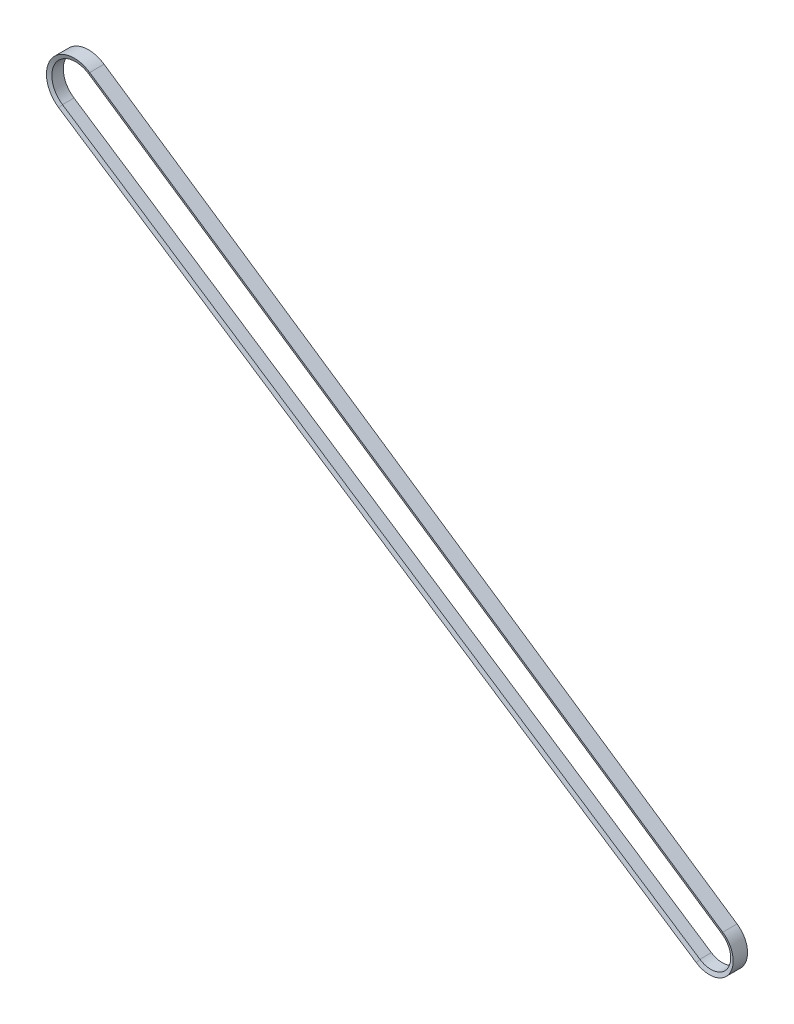
ISO-10303-21;
HEADER;
FILE_DESCRIPTION(('STEP AP214'),'2;1');
FILE_NAME('part.step','',(''),(''),'','','');
FILE_SCHEMA(('AUTOMOTIVE_DESIGN { 1 0 10303 214 1 1 1 1 }'));
ENDSEC;
DATA;
#1=APPLICATION_CONTEXT('core data for automotive mechanical design processes');
#2=APPLICATION_PROTOCOL_DEFINITION('international standard','automotive_design',2000,#1);
#3=PRODUCT_CONTEXT('',#1,'mechanical');
#4=PRODUCT('Part','Part','',(#3));
#5=PRODUCT_RELATED_PRODUCT_CATEGORY('part','',(#4));
#6=PRODUCT_DEFINITION_FORMATION('','',#4);
#7=PRODUCT_DEFINITION_CONTEXT('part definition',#1,'design');
#8=PRODUCT_DEFINITION('design','',#6,#7);
#9=PRODUCT_DEFINITION_SHAPE('','',#8);
#10=(LENGTH_UNIT() NAMED_UNIT(*) SI_UNIT(.MILLI.,.METRE.));
#11=(NAMED_UNIT(*) PLANE_ANGLE_UNIT() SI_UNIT($,.RADIAN.));
#12=(NAMED_UNIT(*) SI_UNIT($,.STERADIAN.) SOLID_ANGLE_UNIT());
#13=UNCERTAINTY_MEASURE_WITH_UNIT(LENGTH_MEASURE(1.E-05),#10,'distance_accuracy_value','');
#14=(GEOMETRIC_REPRESENTATION_CONTEXT(3) GLOBAL_UNCERTAINTY_ASSIGNED_CONTEXT((#13)) GLOBAL_UNIT_ASSIGNED_CONTEXT((#10,
#11,#12)) REPRESENTATION_CONTEXT('',''));
#15=CARTESIAN_POINT('',(0.,0.,0.));
#16=DIRECTION('',(0.,0.,1.));
#17=DIRECTION('',(1.,0.,0.));
#18=AXIS2_PLACEMENT_3D('',#15,#16,#17);
#19=CARTESIAN_POINT('',(169.595632407652,-113.406898021926,-1.535));
#20=DIRECTION('',(0.,0.,-1.));
#21=DIRECTION('',(-1.,0.,0.));
#22=AXIS2_PLACEMENT_3D('',#19,#20,#21);
#23=CONICAL_SURFACE('',#22,5.29999999999987,1.22173047639603);
#24=DIRECTION('',(-0.518306560970144,-0.783824298178355,-0.34202014332567));
#25=VECTOR('',#24,1.);
#26=CARTESIAN_POINT('',(166.672309703638,-117.827778518862,-1.535));
#27=LINE('',#26,#25);
#28=CARTESIAN_POINT('',(166.672309703638,-117.827778518862,-1.535));
#29=VERTEX_POINT('',#28);
#30=CARTESIAN_POINT('',(166.09205970658,-118.705278594996,-1.91789537911135));
#31=VERTEX_POINT('',#30);
#32=EDGE_CURVE('E155',#29,#31,#27,.T.);
#33=ORIENTED_EDGE('',*,*,#32,.F.);
#34=CARTESIAN_POINT('',(169.595632407652,-113.406898021926,-1.535));
#35=DIRECTION('',(0.,0.,1.));
#36=DIRECTION('',(-0.551570321512103,-0.834128395648437,0.));
#37=AXIS2_PLACEMENT_3D('',#34,#35,#36);
#38=CIRCLE('',#37,5.29999999999987);
#39=CARTESIAN_POINT('',(172.564390372754,-109.016399628276,-1.535));
#40=VERTEX_POINT('',#39);
#41=EDGE_CURVE('E154',#29,#40,#38,.T.);
#42=ORIENTED_EDGE('',*,*,#41,.T.);
#43=DIRECTION('',(0.526362255227613,0.778437536242433,-0.34202014332567));
#44=VECTOR('',#43,1.);
#45=CARTESIAN_POINT('',(172.564390372754,-109.016399628276,-1.535));
#46=LINE('',#45,#44);
#47=CARTESIAN_POINT('',(173.153658809711,-108.14493009243,-1.91789537911135));
#48=VERTEX_POINT('',#47);
#49=EDGE_CURVE('E133',#40,#48,#46,.T.);
#50=ORIENTED_EDGE('',*,*,#49,.T.);
#51=CARTESIAN_POINT('',(169.595632407652,-113.406898021926,-1.91789537911135));
#52=DIRECTION('',(0.,0.,1.));
#53=DIRECTION('',(-0.551570321512162,-0.834128395648398,0.));
#54=AXIS2_PLACEMENT_3D('',#51,#52,#53);
#55=CIRCLE('',#54,6.35199640812177);
#56=EDGE_CURVE('E159',#31,#48,#55,.T.);
#57=ORIENTED_EDGE('',*,*,#56,.F.);
#58=EDGE_LOOP('',(#33,#42,#50,#57));
#59=FACE_BOUND('',#58,.T.);
#60=ADVANCED_FACE('F39',(#59),#23,.F.);
#61=CARTESIAN_POINT('',(172.564390372754,-109.016399628276,-1.535));
#62=DIRECTION('',(0.191580193343956,0.28332809242785,0.939692620785908));
#63=DIRECTION('',(0.,-0.957427077668651,0.288675234384364));
#64=AXIS2_PLACEMENT_3D('',#61,#62,#63);
#65=PLANE('',#64);
#66=DIRECTION('',(-0.828395923330359,0.560143012283151,0.));
#67=VECTOR('',#66,1.);
#68=CARTESIAN_POINT('',(173.153658809711,-108.14493009243,-1.91789537911135));
#69=LINE('',#68,#67);
#70=CARTESIAN_POINT('',(4.14729483919354,6.13343746505411,-1.91789537911135));
#71=VERTEX_POINT('',#70);
#72=EDGE_CURVE('E123',#48,#71,#69,.T.);
#73=ORIENTED_EDGE('',*,*,#72,.F.);
#74=ORIENTED_EDGE('',*,*,#49,.F.);
#75=DIRECTION('',(-0.828395923330359,0.560143012283151,0.));
#76=VECTOR('',#75,1.);
#77=CARTESIAN_POINT('',(172.564390372754,-109.016399628276,-1.535));
#78=LINE('',#77,#76);
#79=CARTESIAN_POINT('',(3.55802640223668,5.26196792920798,-1.535));
#80=VERTEX_POINT('',#79);
#81=EDGE_CURVE('E136',#40,#80,#78,.T.);
#82=ORIENTED_EDGE('',*,*,#81,.T.);
#83=DIRECTION('',(0.526362255227613,0.778437536242433,-0.34202014332567));
#84=VECTOR('',#83,1.);
#85=CARTESIAN_POINT('',(3.55802640223674,5.26196792920795,-1.535));
#86=LINE('',#85,#84);
#87=EDGE_CURVE('E151',#80,#71,#86,.T.);
#88=ORIENTED_EDGE('',*,*,#87,.T.);
#89=EDGE_LOOP('',(#73,#74,#82,#88));
#90=FACE_BOUND('',#89,.T.);
#91=ADVANCED_FACE('F135',(#90),#65,.F.);
#92=CARTESIAN_POINT('',(173.153658809711,-108.14493009243,-1.91789537911135));
#93=DIRECTION('',(-0.560143012283151,-0.828395923330359,0.));
#94=DIRECTION('',(0.828395923330359,-0.560143012283151,0.));
#95=AXIS2_PLACEMENT_3D('',#92,#93,#94);
#96=PLANE('',#95);
#97=DIRECTION('',(-0.828395923330359,0.560143012283151,0.));
#98=VECTOR('',#97,1.);
#99=CARTESIAN_POINT('',(173.153658809711,-108.14493009243,1.91789537911135));
#100=LINE('',#99,#98);
#101=CARTESIAN_POINT('',(173.153658809711,-108.14493009243,1.91789537911135));
#102=VERTEX_POINT('',#101);
#103=CARTESIAN_POINT('',(4.14729483919354,6.13343746505411,1.91789537911135));
#104=VERTEX_POINT('',#103);
#105=EDGE_CURVE('E117',#102,#104,#100,.T.);
#106=ORIENTED_EDGE('',*,*,#105,.F.);
#107=DIRECTION('',(0.,0.,1.));
#108=VECTOR('',#107,1.);
#109=CARTESIAN_POINT('',(173.153658809711,-108.14493009243,-1.91789537911135));
#110=LINE('',#109,#108);
#111=EDGE_CURVE('E141',#48,#102,#110,.T.);
#112=ORIENTED_EDGE('',*,*,#111,.F.);
#113=ORIENTED_EDGE('',*,*,#72,.T.);
#114=DIRECTION('',(0.,0.,1.));
#115=VECTOR('',#114,1.);
#116=CARTESIAN_POINT('',(4.1472948391936,6.13343746505408,-1.91789537911135));
#117=LINE('',#116,#115);
#118=EDGE_CURVE('E192',#71,#104,#117,.T.);
#119=ORIENTED_EDGE('',*,*,#118,.T.);
#120=EDGE_LOOP('',(#106,#112,#113,#119));
#121=FACE_BOUND('',#120,.T.);
#122=ADVANCED_FACE('F218',(#121),#96,.F.);
#123=CARTESIAN_POINT('',(172.564390372754,-109.016399628276,1.535));
#124=DIRECTION('',(0.191580193343956,0.28332809242785,-0.939692620785908));
#125=DIRECTION('',(0.,0.957427077668651,0.288675234384364));
#126=AXIS2_PLACEMENT_3D('',#123,#124,#125);
#127=PLANE('',#126);
#128=DIRECTION('',(-0.828395923330359,0.560143012283151,0.));
#129=VECTOR('',#128,1.);
#130=CARTESIAN_POINT('',(172.564390372754,-109.016399628276,1.535));
#131=LINE('',#130,#129);
#132=CARTESIAN_POINT('',(172.564390372754,-109.016399628276,1.535));
#133=VERTEX_POINT('',#132);
#134=CARTESIAN_POINT('',(3.55802640223668,5.26196792920798,1.535));
#135=VERTEX_POINT('',#134);
#136=EDGE_CURVE('E169',#133,#135,#131,.T.);
#137=ORIENTED_EDGE('',*,*,#136,.F.);
#138=DIRECTION('',(0.526362255227613,0.778437536242433,0.34202014332567));
#139=VECTOR('',#138,1.);
#140=CARTESIAN_POINT('',(172.564390372754,-109.016399628276,1.535));
#141=LINE('',#140,#139);
#142=EDGE_CURVE('E162',#102,#133,#141,.F.);
#143=ORIENTED_EDGE('',*,*,#142,.F.);
#144=ORIENTED_EDGE('',*,*,#105,.T.);
#145=DIRECTION('',(0.526362255227613,0.778437536242433,0.34202014332567));
#146=VECTOR('',#145,1.);
#147=CARTESIAN_POINT('',(3.55802640223674,5.26196792920795,1.535));
#148=LINE('',#147,#146);
#149=EDGE_CURVE('E191',#104,#135,#148,.F.);
#150=ORIENTED_EDGE('',*,*,#149,.T.);
#151=EDGE_LOOP('',(#137,#143,#144,#150));
#152=FACE_BOUND('',#151,.T.);
#153=ADVANCED_FACE('F190',(#152),#127,.F.);
#154=CARTESIAN_POINT('',(172.564390372754,-109.016399628276,1.535));
#155=DIRECTION('',(0.560143012283151,0.828395923330359,0.));
#156=DIRECTION('',(-0.828395923330359,0.560143012283151,0.));
#157=AXIS2_PLACEMENT_3D('',#154,#155,#156);
#158=PLANE('',#157);
#159=DIRECTION('',(0.,0.,-1.));
#160=VECTOR('',#159,1.);
#161=CARTESIAN_POINT('',(3.55802640223674,5.26196792920795,1.535));
#162=LINE('',#161,#160);
#163=EDGE_CURVE('E149',#135,#80,#162,.T.);
#164=ORIENTED_EDGE('',*,*,#163,.T.);
#165=ORIENTED_EDGE('',*,*,#81,.F.);
#166=DIRECTION('',(0.,0.,-1.));
#167=VECTOR('',#166,1.);
#168=CARTESIAN_POINT('',(172.564390372754,-109.016399628276,1.535));
#169=LINE('',#168,#167);
#170=EDGE_CURVE('E148',#133,#40,#169,.T.);
#171=ORIENTED_EDGE('',*,*,#170,.F.);
#172=ORIENTED_EDGE('',*,*,#136,.T.);
#173=EDGE_LOOP('',(#164,#165,#171,#172));
#174=FACE_BOUND('',#173,.T.);
#175=ADVANCED_FACE('F146',(#174),#158,.F.);
#176=CARTESIAN_POINT('',(1.79856129989275E-10,-2.89102075612391E-10,-1.535));
#177=DIRECTION('',(0.,0.,-1.));
#178=DIRECTION('',(-1.,0.,0.));
#179=AXIS2_PLACEMENT_3D('',#176,#177,#178);
#180=CONICAL_SURFACE('',#179,6.35199640812159,1.22173047639603);
#181=CARTESIAN_POINT('',(1.79856129989275E-10,-2.89102075612391E-10,-1.91789537911135));
#182=DIRECTION('',(0.,0.,1.));
#183=DIRECTION('',(0.560143012283193,0.82839592333033,0.));
#184=AXIS2_PLACEMENT_3D('',#181,#182,#183);
#185=CIRCLE('',#184,7.40399281624352);
#186=CARTESIAN_POINT('',(-4.08382269795205,-6.17588064949277,-1.91789537911135));
#187=VERTEX_POINT('',#186);
#188=EDGE_CURVE('E104',#71,#187,#185,.T.);
#189=ORIENTED_EDGE('',*,*,#188,.F.);
#190=ORIENTED_EDGE('',*,*,#87,.F.);
#191=CARTESIAN_POINT('',(1.79856129989275E-10,-2.89102075612391E-10,-1.535));
#192=DIRECTION('',(0.,0.,1.));
#193=DIRECTION('',(0.560143012283139,0.828395923330367,0.));
#194=AXIS2_PLACEMENT_3D('',#191,#192,#193);
#195=CIRCLE('',#194,6.35199640812159);
#196=CARTESIAN_POINT('',(-3.50357270089388,-5.29838057335862,-1.535));
#197=VERTEX_POINT('',#196);
#198=EDGE_CURVE('E168',#80,#197,#195,.T.);
#199=ORIENTED_EDGE('',*,*,#198,.T.);
#200=DIRECTION('',(-0.518306560970144,-0.783824298178355,-0.34202014332567));
#201=VECTOR('',#200,1.);
#202=CARTESIAN_POINT('',(-3.50357270089388,-5.29838057335862,-1.535));
#203=LINE('',#202,#201);
#204=EDGE_CURVE('E177',#197,#187,#203,.T.);
#205=ORIENTED_EDGE('',*,*,#204,.T.);
#206=EDGE_LOOP('',(#189,#190,#199,#205));
#207=FACE_BOUND('',#206,.T.);
#208=ADVANCED_FACE('F214',(#207),#180,.F.);
#209=CARTESIAN_POINT('',(1.79856129989275E-10,-2.89102075612391E-10,0.));
#210=DIRECTION('',(0.,0.,1.));
#211=DIRECTION('',(1.,0.,0.));
#212=AXIS2_PLACEMENT_3D('',#209,#210,#211);
#213=CYLINDRICAL_SURFACE('',#212,7.40399281624352);
#214=CARTESIAN_POINT('',(1.79856129989275E-10,-2.89102075612391E-10,1.91789537911135));
#215=DIRECTION('',(0.,0.,1.));
#216=DIRECTION('',(0.560143012283193,0.82839592333033,0.));
#217=AXIS2_PLACEMENT_3D('',#214,#215,#216);
#218=CIRCLE('',#217,7.40399281624352);
#219=CARTESIAN_POINT('',(-4.08382269795205,-6.17588064949277,1.91789537911135));
#220=VERTEX_POINT('',#219);
#221=EDGE_CURVE('E97',#104,#220,#218,.T.);
#222=ORIENTED_EDGE('',*,*,#221,.F.);
#223=ORIENTED_EDGE('',*,*,#118,.F.);
#224=ORIENTED_EDGE('',*,*,#188,.T.);
#225=DIRECTION('',(0.,0.,1.));
#226=VECTOR('',#225,1.);
#227=CARTESIAN_POINT('',(-4.08382269795204,-6.17588064949276,-1.91789537911135));
#228=LINE('',#227,#226);
#229=EDGE_CURVE('E175',#187,#220,#228,.T.);
#230=ORIENTED_EDGE('',*,*,#229,.T.);
#231=EDGE_LOOP('',(#222,#223,#224,#230));
#232=FACE_BOUND('',#231,.T.);
#233=ADVANCED_FACE('F217',(#232),#213,.T.);
#234=CARTESIAN_POINT('',(1.79856129989275E-10,-2.89102075612391E-10,1.91789537911135));
#235=DIRECTION('',(0.,0.,1.));
#236=DIRECTION('',(1.,0.,0.));
#237=AXIS2_PLACEMENT_3D('',#234,#235,#236);
#238=CONICAL_SURFACE('',#237,7.40399281624352,1.22173047639603);
#239=CARTESIAN_POINT('',(1.79856129989275E-10,-2.89102075612391E-10,1.535));
#240=DIRECTION('',(0.,0.,1.));
#241=DIRECTION('',(0.560143012283139,0.828395923330367,0.));
#242=AXIS2_PLACEMENT_3D('',#239,#240,#241);
#243=CIRCLE('',#242,6.35199640812159);
#244=CARTESIAN_POINT('',(-3.50357270089388,-5.29838057335862,1.535));
#245=VERTEX_POINT('',#244);
#246=EDGE_CURVE('E88',#135,#245,#243,.T.);
#247=ORIENTED_EDGE('',*,*,#246,.F.);
#248=ORIENTED_EDGE('',*,*,#149,.F.);
#249=ORIENTED_EDGE('',*,*,#221,.T.);
#250=DIRECTION('',(-0.518306560970144,-0.783824298178355,0.34202014332567));
#251=VECTOR('',#250,1.);
#252=CARTESIAN_POINT('',(-3.50357270089388,-5.29838057335862,1.535));
#253=LINE('',#252,#251);
#254=EDGE_CURVE('E172',#220,#245,#253,.F.);
#255=ORIENTED_EDGE('',*,*,#254,.T.);
#256=EDGE_LOOP('',(#247,#248,#249,#255));
#257=FACE_BOUND('',#256,.T.);
#258=ADVANCED_FACE('F236',(#257),#238,.F.);
#259=CARTESIAN_POINT('',(1.79856129989275E-10,-2.89102075612391E-10,0.));
#260=DIRECTION('',(0.,0.,1.));
#261=DIRECTION('',(1.,0.,0.));
#262=AXIS2_PLACEMENT_3D('',#259,#260,#261);
#263=CYLINDRICAL_SURFACE('',#262,6.35199640812159);
#264=DIRECTION('',(0.,0.,-1.));
#265=VECTOR('',#264,1.);
#266=CARTESIAN_POINT('',(-3.50357270089388,-5.29838057335862,1.535));
#267=LINE('',#266,#265);
#268=EDGE_CURVE('E170',#245,#197,#267,.T.);
#269=ORIENTED_EDGE('',*,*,#268,.T.);
#270=ORIENTED_EDGE('',*,*,#198,.F.);
#271=ORIENTED_EDGE('',*,*,#163,.F.);
#272=ORIENTED_EDGE('',*,*,#246,.T.);
#273=EDGE_LOOP('',(#269,#270,#271,#272));
#274=FACE_BOUND('',#273,.T.);
#275=ADVANCED_FACE('F228',(#274),#263,.F.);
#276=CARTESIAN_POINT('',(-3.50357270089391,-5.29838057335857,-1.535));
#277=DIRECTION('',(-0.188648160417887,-0.285288713431602,0.939692620785908));
#278=DIRECTION('',(0.,-0.956873533769908,-0.290504802663724));
#279=AXIS2_PLACEMENT_3D('',#276,#277,#278);
#280=PLANE('',#279);
#281=DIRECTION('',(0.834128395648182,-0.551570321512488,0.));
#282=VECTOR('',#281,1.);
#283=CARTESIAN_POINT('',(-4.08382269795207,-6.17588064949272,-1.91789537911135));
#284=LINE('',#283,#282);
#285=EDGE_CURVE('E199',#187,#31,#284,.T.);
#286=ORIENTED_EDGE('',*,*,#285,.F.);
#287=ORIENTED_EDGE('',*,*,#204,.F.);
#288=DIRECTION('',(0.834128395648182,-0.551570321512488,0.));
#289=VECTOR('',#288,1.);
#290=CARTESIAN_POINT('',(-3.50357270089391,-5.29838057335857,-1.535));
#291=LINE('',#290,#289);
#292=EDGE_CURVE('E171',#197,#29,#291,.T.);
#293=ORIENTED_EDGE('',*,*,#292,.T.);
#294=ORIENTED_EDGE('',*,*,#32,.T.);
#295=EDGE_LOOP('',(#286,#287,#293,#294));
#296=FACE_BOUND('',#295,.T.);
#297=ADVANCED_FACE('F226',(#296),#280,.F.);
#298=CARTESIAN_POINT('',(-4.08382269795207,-6.17588064949272,-1.91789537911135));
#299=DIRECTION('',(0.551570321512488,0.834128395648182,0.));
#300=DIRECTION('',(-0.834128395648182,0.551570321512488,0.));
#301=AXIS2_PLACEMENT_3D('',#298,#299,#300);
#302=PLANE('',#301);
#303=DIRECTION('',(0.834128395648182,-0.551570321512488,0.));
#304=VECTOR('',#303,1.);
#305=CARTESIAN_POINT('',(-4.08382269795207,-6.17588064949272,1.91789537911135));
#306=LINE('',#305,#304);
#307=CARTESIAN_POINT('',(166.09205970658,-118.705278594996,1.91789537911135));
#308=VERTEX_POINT('',#307);
#309=EDGE_CURVE('E64',#220,#308,#306,.T.);
#310=ORIENTED_EDGE('',*,*,#309,.F.);
#311=ORIENTED_EDGE('',*,*,#229,.F.);
#312=ORIENTED_EDGE('',*,*,#285,.T.);
#313=DIRECTION('',(0.,0.,1.));
#314=VECTOR('',#313,1.);
#315=CARTESIAN_POINT('',(166.09205970658,-118.705278594996,-1.91789537911135));
#316=LINE('',#315,#314);
#317=EDGE_CURVE('E197',#31,#308,#316,.T.);
#318=ORIENTED_EDGE('',*,*,#317,.T.);
#319=EDGE_LOOP('',(#310,#311,#312,#318));
#320=FACE_BOUND('',#319,.T.);
#321=ADVANCED_FACE('F223',(#320),#302,.F.);
#322=CARTESIAN_POINT('',(-3.50357270089391,-5.29838057335857,1.535));
#323=DIRECTION('',(-0.188648160417887,-0.285288713431602,-0.939692620785908));
#324=DIRECTION('',(0.,0.956873533769908,-0.290504802663724));
#325=AXIS2_PLACEMENT_3D('',#322,#323,#324);
#326=PLANE('',#325);
#327=DIRECTION('',(0.834128395648182,-0.551570321512488,0.));
#328=VECTOR('',#327,1.);
#329=CARTESIAN_POINT('',(-3.50357270089391,-5.29838057335857,1.535));
#330=LINE('',#329,#328);
#331=CARTESIAN_POINT('',(166.672309703638,-117.827778518862,1.535));
#332=VERTEX_POINT('',#331);
#333=EDGE_CURVE('E56',#245,#332,#330,.T.);
#334=ORIENTED_EDGE('',*,*,#333,.F.);
#335=ORIENTED_EDGE('',*,*,#254,.F.);
#336=ORIENTED_EDGE('',*,*,#309,.T.);
#337=DIRECTION('',(-0.518306560970144,-0.783824298178355,0.34202014332567));
#338=VECTOR('',#337,1.);
#339=CARTESIAN_POINT('',(166.672309703638,-117.827778518862,1.535));
#340=LINE('',#339,#338);
#341=EDGE_CURVE('E183',#308,#332,#340,.F.);
#342=ORIENTED_EDGE('',*,*,#341,.T.);
#343=EDGE_LOOP('',(#334,#335,#336,#342));
#344=FACE_BOUND('',#343,.T.);
#345=ADVANCED_FACE('F234',(#344),#326,.F.);
#346=CARTESIAN_POINT('',(-3.50357270089391,-5.29838057335857,1.535));
#347=DIRECTION('',(-0.551570321512488,-0.834128395648182,0.));
#348=DIRECTION('',(0.834128395648182,-0.551570321512488,0.));
#349=AXIS2_PLACEMENT_3D('',#346,#347,#348);
#350=PLANE('',#349);
#351=DIRECTION('',(0.,0.,-1.));
#352=VECTOR('',#351,1.);
#353=CARTESIAN_POINT('',(166.672309703638,-117.827778518862,1.535));
#354=LINE('',#353,#352);
#355=EDGE_CURVE('E43',#332,#29,#354,.T.);
#356=ORIENTED_EDGE('',*,*,#355,.T.);
#357=ORIENTED_EDGE('',*,*,#292,.F.);
#358=ORIENTED_EDGE('',*,*,#268,.F.);
#359=ORIENTED_EDGE('',*,*,#333,.T.);
#360=EDGE_LOOP('',(#356,#357,#358,#359));
#361=FACE_BOUND('',#360,.T.);
#362=ADVANCED_FACE('F184',(#361),#350,.F.);
#363=CARTESIAN_POINT('',(169.595632407652,-113.406898021926,0.));
#364=DIRECTION('',(0.,0.,1.));
#365=DIRECTION('',(1.,0.,0.));
#366=AXIS2_PLACEMENT_3D('',#363,#364,#365);
#367=CYLINDRICAL_SURFACE('',#366,6.35199640812177);
#368=ORIENTED_EDGE('',*,*,#56,.T.);
#369=ORIENTED_EDGE('',*,*,#111,.T.);
#370=CARTESIAN_POINT('',(169.595632407652,-113.406898021926,1.91789537911135));
#371=DIRECTION('',(0.,0.,1.));
#372=DIRECTION('',(-0.551570321512162,-0.834128395648398,0.));
#373=AXIS2_PLACEMENT_3D('',#370,#371,#372);
#374=CIRCLE('',#373,6.35199640812177);
#375=EDGE_CURVE('E48',#308,#102,#374,.T.);
#376=ORIENTED_EDGE('',*,*,#375,.F.);
#377=ORIENTED_EDGE('',*,*,#317,.F.);
#378=EDGE_LOOP('',(#368,#369,#376,#377));
#379=FACE_BOUND('',#378,.T.);
#380=ADVANCED_FACE('F220',(#379),#367,.T.);
#381=CARTESIAN_POINT('',(169.595632407652,-113.406898021926,1.91789537911135));
#382=DIRECTION('',(0.,0.,1.));
#383=DIRECTION('',(1.,0.,0.));
#384=AXIS2_PLACEMENT_3D('',#381,#382,#383);
#385=CONICAL_SURFACE('',#384,6.35199640812181,1.22173047639603);
#386=ORIENTED_EDGE('',*,*,#375,.T.);
#387=ORIENTED_EDGE('',*,*,#142,.T.);
#388=CARTESIAN_POINT('',(169.595632407652,-113.406898021926,1.535));
#389=DIRECTION('',(0.,0.,1.));
#390=DIRECTION('',(-0.551570321512103,-0.834128395648437,0.));
#391=AXIS2_PLACEMENT_3D('',#388,#389,#390);
#392=CIRCLE('',#391,5.29999999999987);
#393=EDGE_CURVE('E11',#332,#133,#392,.T.);
#394=ORIENTED_EDGE('',*,*,#393,.F.);
#395=ORIENTED_EDGE('',*,*,#341,.F.);
#396=EDGE_LOOP('',(#386,#387,#394,#395));
#397=FACE_BOUND('',#396,.T.);
#398=ADVANCED_FACE('F188',(#397),#385,.F.);
#399=CARTESIAN_POINT('',(169.595632407652,-113.406898021926,0.));
#400=DIRECTION('',(0.,0.,1.));
#401=DIRECTION('',(1.,0.,0.));
#402=AXIS2_PLACEMENT_3D('',#399,#400,#401);
#403=CYLINDRICAL_SURFACE('',#402,5.29999999999987);
#404=ORIENTED_EDGE('',*,*,#393,.T.);
#405=ORIENTED_EDGE('',*,*,#170,.T.);
#406=ORIENTED_EDGE('',*,*,#41,.F.);
#407=ORIENTED_EDGE('',*,*,#355,.F.);
#408=EDGE_LOOP('',(#404,#405,#406,#407));
#409=FACE_BOUND('',#408,.T.);
#410=ADVANCED_FACE('F41',(#409),#403,.F.);
#411=CLOSED_SHELL('',(#60,#91,#122,#153,#175,#208,#233,#258,#275,#297,#321,#345,#362,#380,#398,#410));
#412=MANIFOLD_SOLID_BREP('B2',#411);
#413=ADVANCED_BREP_SHAPE_REPRESENTATION('',(#18,#412),#14);
#414=SHAPE_DEFINITION_REPRESENTATION(#9,#413);
ENDSEC;
END-ISO-10303-21;
